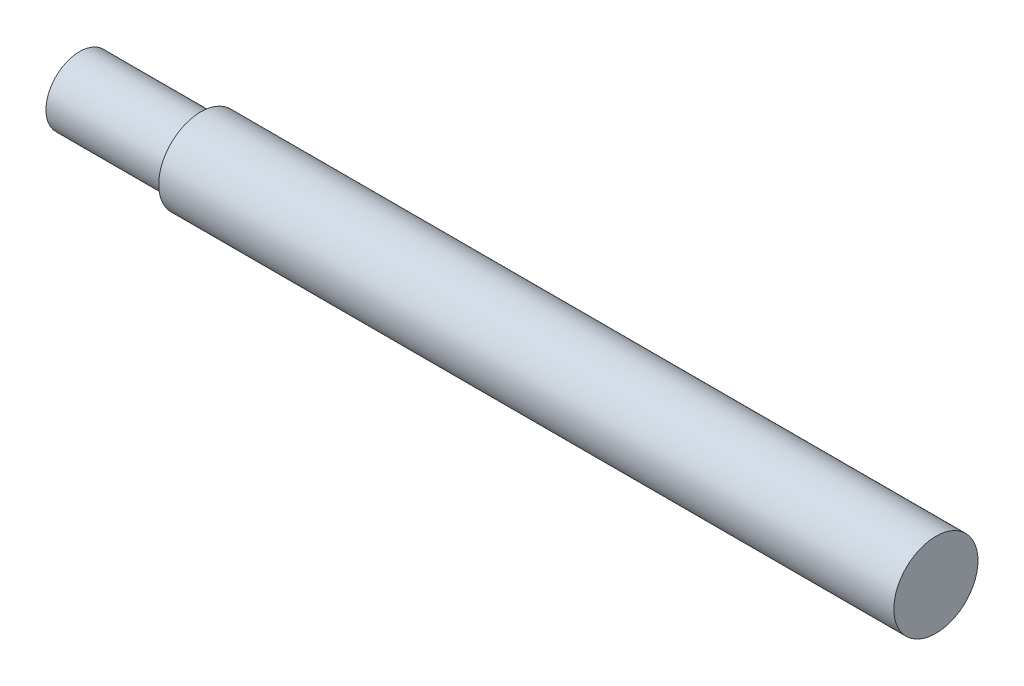
ISO-10303-21;
HEADER;
FILE_DESCRIPTION(('STEP AP214'),'2;1');
FILE_NAME('part.step','',(''),(''),'','','');
FILE_SCHEMA(('AUTOMOTIVE_DESIGN { 1 0 10303 214 1 1 1 1 }'));
ENDSEC;
DATA;
#1=APPLICATION_CONTEXT('core data for automotive mechanical design processes');
#2=APPLICATION_PROTOCOL_DEFINITION('international standard','automotive_design',2000,#1);
#3=PRODUCT_CONTEXT('',#1,'mechanical');
#4=PRODUCT('Part','Part','',(#3));
#5=PRODUCT_RELATED_PRODUCT_CATEGORY('part','',(#4));
#6=PRODUCT_DEFINITION_FORMATION('','',#4);
#7=PRODUCT_DEFINITION_CONTEXT('part definition',#1,'design');
#8=PRODUCT_DEFINITION('design','',#6,#7);
#9=PRODUCT_DEFINITION_SHAPE('','',#8);
#10=(LENGTH_UNIT() NAMED_UNIT(*) SI_UNIT(.MILLI.,.METRE.));
#11=(NAMED_UNIT(*) PLANE_ANGLE_UNIT() SI_UNIT($,.RADIAN.));
#12=(NAMED_UNIT(*) SI_UNIT($,.STERADIAN.) SOLID_ANGLE_UNIT());
#13=UNCERTAINTY_MEASURE_WITH_UNIT(LENGTH_MEASURE(1.E-05),#10,'distance_accuracy_value','');
#14=(GEOMETRIC_REPRESENTATION_CONTEXT(3) GLOBAL_UNCERTAINTY_ASSIGNED_CONTEXT((#13)) GLOBAL_UNIT_ASSIGNED_CONTEXT((#10,
#11,#12)) REPRESENTATION_CONTEXT('',''));
#15=CARTESIAN_POINT('',(0.,0.,0.));
#16=DIRECTION('',(0.,0.,1.));
#17=DIRECTION('',(1.,0.,0.));
#18=AXIS2_PLACEMENT_3D('',#15,#16,#17);
#19=CARTESIAN_POINT('',(69.342,0.,0.));
#20=DIRECTION('',(-1.,0.,0.));
#21=DIRECTION('',(0.,0.,1.));
#22=AXIS2_PLACEMENT_3D('',#19,#20,#21);
#23=CYLINDRICAL_SURFACE('',#22,3.96875);
#24=CARTESIAN_POINT('',(69.342,0.,0.));
#25=DIRECTION('',(1.,0.,0.));
#26=DIRECTION('',(0.,0.,-1.));
#27=AXIS2_PLACEMENT_3D('',#24,#25,#26);
#28=CIRCLE('',#27,3.96875);
#29=CARTESIAN_POINT('',(69.342,0.,-3.96875));
#30=VERTEX_POINT('',#29);
#31=EDGE_CURVE('E10',#30,#30,#28,.T.);
#32=ORIENTED_EDGE('',*,*,#31,.F.);
#33=EDGE_LOOP('',(#32));
#34=FACE_BOUND('',#33,.T.);
#35=CARTESIAN_POINT('',(0.,0.,0.));
#36=DIRECTION('',(1.,0.,0.));
#37=DIRECTION('',(0.,0.,-1.));
#38=AXIS2_PLACEMENT_3D('',#35,#36,#37);
#39=CIRCLE('',#38,3.96875);
#40=CARTESIAN_POINT('',(0.,0.,-3.96875));
#41=VERTEX_POINT('',#40);
#42=EDGE_CURVE('E34',#41,#41,#39,.T.);
#43=ORIENTED_EDGE('',*,*,#42,.T.);
#44=EDGE_LOOP('',(#43));
#45=FACE_BOUND('',#44,.T.);
#46=ADVANCED_FACE('F31',(#34,#45),#23,.T.);
#47=CARTESIAN_POINT('',(69.342,0.,0.));
#48=DIRECTION('',(1.,0.,0.));
#49=DIRECTION('',(0.,0.,-1.));
#50=AXIS2_PLACEMENT_3D('',#47,#48,#49);
#51=PLANE('',#50);
#52=ORIENTED_EDGE('',*,*,#31,.T.);
#53=EDGE_LOOP('',(#52));
#54=FACE_BOUND('',#53,.T.);
#55=ADVANCED_FACE('F61',(#54),#51,.T.);
#56=CARTESIAN_POINT('',(0.,0.,0.));
#57=DIRECTION('',(1.,0.,0.));
#58=DIRECTION('',(0.,0.,-1.));
#59=AXIS2_PLACEMENT_3D('',#56,#57,#58);
#60=PLANE('',#59);
#61=CARTESIAN_POINT('',(0.,0.,0.));
#62=DIRECTION('',(1.,0.,0.));
#63=DIRECTION('',(0.,0.,-1.));
#64=AXIS2_PLACEMENT_3D('',#61,#62,#63);
#65=CIRCLE('',#64,3.175);
#66=CARTESIAN_POINT('',(0.,0.,-3.175));
#67=VERTEX_POINT('',#66);
#68=EDGE_CURVE('E43',#67,#67,#65,.T.);
#69=ORIENTED_EDGE('',*,*,#68,.T.);
#70=EDGE_LOOP('',(#69));
#71=FACE_BOUND('',#70,.T.);
#72=ORIENTED_EDGE('',*,*,#42,.F.);
#73=EDGE_LOOP('',(#72));
#74=FACE_BOUND('',#73,.T.);
#75=ADVANCED_FACE('F58',(#71,#74),#60,.F.);
#76=CARTESIAN_POINT('',(-11.43,0.,0.));
#77=DIRECTION('',(1.,0.,0.));
#78=DIRECTION('',(0.,0.,-1.));
#79=AXIS2_PLACEMENT_3D('',#76,#77,#78);
#80=CYLINDRICAL_SURFACE('',#79,3.175);
#81=CARTESIAN_POINT('',(-11.43,0.,0.));
#82=DIRECTION('',(1.,0.,0.));
#83=DIRECTION('',(0.,0.,-1.));
#84=AXIS2_PLACEMENT_3D('',#81,#82,#83);
#85=CIRCLE('',#84,3.175);
#86=CARTESIAN_POINT('',(-11.43,0.,-3.175));
#87=VERTEX_POINT('',#86);
#88=EDGE_CURVE('E41',#87,#87,#85,.T.);
#89=ORIENTED_EDGE('',*,*,#88,.T.);
#90=EDGE_LOOP('',(#89));
#91=FACE_BOUND('',#90,.T.);
#92=ORIENTED_EDGE('',*,*,#68,.F.);
#93=EDGE_LOOP('',(#92));
#94=FACE_BOUND('',#93,.T.);
#95=ADVANCED_FACE('F49',(#91,#94),#80,.T.);
#96=CARTESIAN_POINT('',(-11.43,0.,0.));
#97=DIRECTION('',(1.,0.,0.));
#98=DIRECTION('',(0.,0.,-1.));
#99=AXIS2_PLACEMENT_3D('',#96,#97,#98);
#100=PLANE('',#99);
#101=ORIENTED_EDGE('',*,*,#88,.F.);
#102=EDGE_LOOP('',(#101));
#103=FACE_BOUND('',#102,.T.);
#104=ADVANCED_FACE('F52',(#103),#100,.F.);
#105=CLOSED_SHELL('',(#46,#55,#75,#95,#104));
#106=MANIFOLD_SOLID_BREP('B2',#105);
#107=ADVANCED_BREP_SHAPE_REPRESENTATION('',(#18,#106),#14);
#108=SHAPE_DEFINITION_REPRESENTATION(#9,#107);
ENDSEC;
END-ISO-10303-21;
